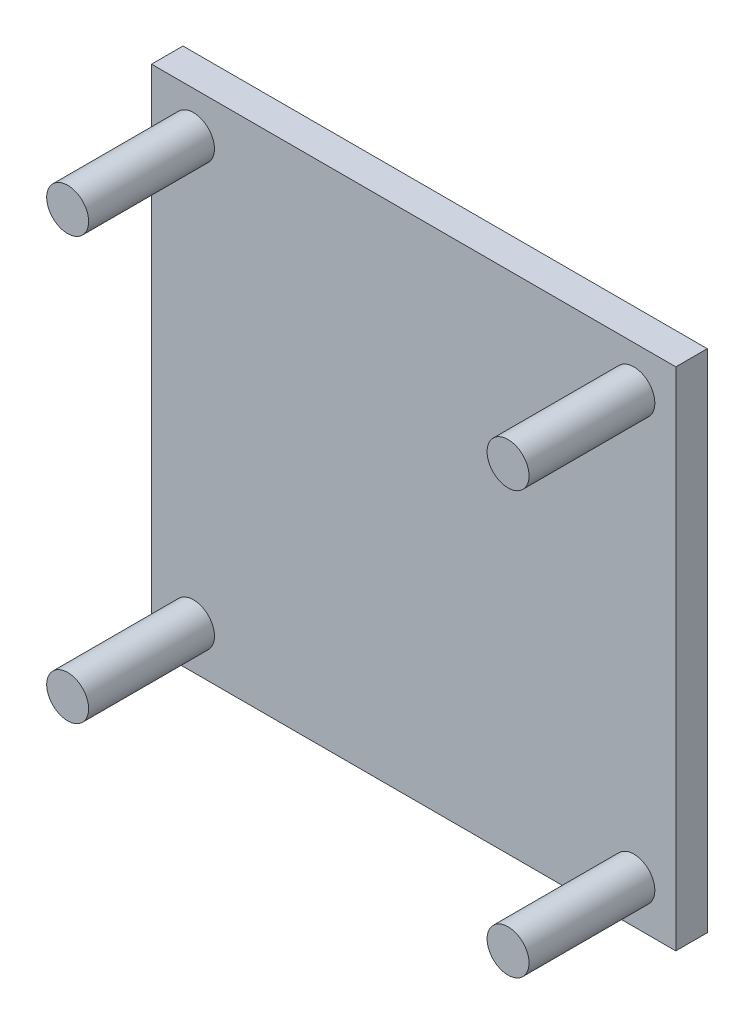
ISO-10303-21;
HEADER;
FILE_DESCRIPTION(('STEP AP214'),'2;1');
FILE_NAME('part.step','',(''),(''),'','','');
FILE_SCHEMA(('AUTOMOTIVE_DESIGN { 1 0 10303 214 1 1 1 1 }'));
ENDSEC;
DATA;
#1=APPLICATION_CONTEXT('core data for automotive mechanical design processes');
#2=APPLICATION_PROTOCOL_DEFINITION('international standard','automotive_design',2000,#1);
#3=PRODUCT_CONTEXT('',#1,'mechanical');
#4=PRODUCT('Part','Part','',(#3));
#5=PRODUCT_RELATED_PRODUCT_CATEGORY('part','',(#4));
#6=PRODUCT_DEFINITION_FORMATION('','',#4);
#7=PRODUCT_DEFINITION_CONTEXT('part definition',#1,'design');
#8=PRODUCT_DEFINITION('design','',#6,#7);
#9=PRODUCT_DEFINITION_SHAPE('','',#8);
#10=(LENGTH_UNIT() NAMED_UNIT(*) SI_UNIT(.MILLI.,.METRE.));
#11=(NAMED_UNIT(*) PLANE_ANGLE_UNIT() SI_UNIT($,.RADIAN.));
#12=(NAMED_UNIT(*) SI_UNIT($,.STERADIAN.) SOLID_ANGLE_UNIT());
#13=UNCERTAINTY_MEASURE_WITH_UNIT(LENGTH_MEASURE(1.E-05),#10,'distance_accuracy_value','');
#14=(GEOMETRIC_REPRESENTATION_CONTEXT(3) GLOBAL_UNCERTAINTY_ASSIGNED_CONTEXT((#13)) GLOBAL_UNIT_ASSIGNED_CONTEXT((#10,
#11,#12)) REPRESENTATION_CONTEXT('',''));
#15=CARTESIAN_POINT('',(0.,0.,0.));
#16=DIRECTION('',(0.,0.,1.));
#17=DIRECTION('',(1.,0.,0.));
#18=AXIS2_PLACEMENT_3D('',#15,#16,#17);
#19=CARTESIAN_POINT('',(-25.,24.1208742223421,3.));
#20=DIRECTION('',(1.,0.,0.));
#21=DIRECTION('',(0.,0.,-1.));
#22=AXIS2_PLACEMENT_3D('',#19,#20,#21);
#23=PLANE('',#22);
#24=DIRECTION('',(0.,-1.,0.));
#25=VECTOR('',#24,1.);
#26=CARTESIAN_POINT('',(-25.,24.1208742223421,0.));
#27=LINE('',#26,#25);
#28=CARTESIAN_POINT('',(-25.,24.1208742223421,0.));
#29=VERTEX_POINT('',#28);
#30=CARTESIAN_POINT('',(-25.,-24.1208742223421,0.));
#31=VERTEX_POINT('',#30);
#32=EDGE_CURVE('E100',#29,#31,#27,.T.);
#33=ORIENTED_EDGE('',*,*,#32,.T.);
#34=DIRECTION('',(0.,0.,-1.));
#35=VECTOR('',#34,1.);
#36=CARTESIAN_POINT('',(-25.,-24.1208742223421,3.));
#37=LINE('',#36,#35);
#38=CARTESIAN_POINT('',(-25.,-24.1208742223421,3.));
#39=VERTEX_POINT('',#38);
#40=EDGE_CURVE('E11',#39,#31,#37,.T.);
#41=ORIENTED_EDGE('',*,*,#40,.F.);
#42=DIRECTION('',(0.,-1.,0.));
#43=VECTOR('',#42,1.);
#44=CARTESIAN_POINT('',(-25.,24.1208742223421,3.));
#45=LINE('',#44,#43);
#46=CARTESIAN_POINT('',(-25.,24.1208742223421,3.));
#47=VERTEX_POINT('',#46);
#48=EDGE_CURVE('E88',#47,#39,#45,.T.);
#49=ORIENTED_EDGE('',*,*,#48,.F.);
#50=DIRECTION('',(0.,0.,-1.));
#51=VECTOR('',#50,1.);
#52=CARTESIAN_POINT('',(-25.,24.1208742223421,3.));
#53=LINE('',#52,#51);
#54=EDGE_CURVE('E96',#47,#29,#53,.T.);
#55=ORIENTED_EDGE('',*,*,#54,.T.);
#56=EDGE_LOOP('',(#33,#41,#49,#55));
#57=FACE_BOUND('',#56,.T.);
#58=ADVANCED_FACE('F37',(#57),#23,.F.);
#59=CARTESIAN_POINT('',(-25.,-24.1208742223421,3.));
#60=DIRECTION('',(0.,1.,0.));
#61=DIRECTION('',(0.,0.,1.));
#62=AXIS2_PLACEMENT_3D('',#59,#60,#61);
#63=PLANE('',#62);
#64=DIRECTION('',(1.,0.,0.));
#65=VECTOR('',#64,1.);
#66=CARTESIAN_POINT('',(-25.,-24.1208742223421,0.));
#67=LINE('',#66,#65);
#68=CARTESIAN_POINT('',(25.,-24.1208742223421,0.));
#69=VERTEX_POINT('',#68);
#70=EDGE_CURVE('E92',#31,#69,#67,.T.);
#71=ORIENTED_EDGE('',*,*,#70,.T.);
#72=DIRECTION('',(0.,0.,-1.));
#73=VECTOR('',#72,1.);
#74=CARTESIAN_POINT('',(25.,-24.1208742223421,3.));
#75=LINE('',#74,#73);
#76=CARTESIAN_POINT('',(25.,-24.1208742223421,3.));
#77=VERTEX_POINT('',#76);
#78=EDGE_CURVE('E45',#77,#69,#75,.T.);
#79=ORIENTED_EDGE('',*,*,#78,.F.);
#80=DIRECTION('',(1.,0.,0.));
#81=VECTOR('',#80,1.);
#82=CARTESIAN_POINT('',(-25.,-24.1208742223421,3.));
#83=LINE('',#82,#81);
#84=EDGE_CURVE('E83',#39,#77,#83,.T.);
#85=ORIENTED_EDGE('',*,*,#84,.F.);
#86=ORIENTED_EDGE('',*,*,#40,.T.);
#87=EDGE_LOOP('',(#71,#79,#85,#86));
#88=FACE_BOUND('',#87,.T.);
#89=ADVANCED_FACE('F91',(#88),#63,.F.);
#90=CARTESIAN_POINT('',(25.,-24.1208742223421,3.));
#91=DIRECTION('',(-1.,0.,0.));
#92=DIRECTION('',(0.,0.,1.));
#93=AXIS2_PLACEMENT_3D('',#90,#91,#92);
#94=PLANE('',#93);
#95=DIRECTION('',(0.,1.,0.));
#96=VECTOR('',#95,1.);
#97=CARTESIAN_POINT('',(25.,-24.1208742223421,0.));
#98=LINE('',#97,#96);
#99=CARTESIAN_POINT('',(25.,24.1208742223421,0.));
#100=VERTEX_POINT('',#99);
#101=EDGE_CURVE('E70',#69,#100,#98,.T.);
#102=ORIENTED_EDGE('',*,*,#101,.T.);
#103=DIRECTION('',(0.,0.,-1.));
#104=VECTOR('',#103,1.);
#105=CARTESIAN_POINT('',(25.,24.1208742223421,3.));
#106=LINE('',#105,#104);
#107=CARTESIAN_POINT('',(25.,24.1208742223421,3.));
#108=VERTEX_POINT('',#107);
#109=EDGE_CURVE('E93',#108,#100,#106,.T.);
#110=ORIENTED_EDGE('',*,*,#109,.F.);
#111=DIRECTION('',(0.,1.,0.));
#112=VECTOR('',#111,1.);
#113=CARTESIAN_POINT('',(25.,-24.1208742223421,3.));
#114=LINE('',#113,#112);
#115=EDGE_CURVE('E86',#77,#108,#114,.T.);
#116=ORIENTED_EDGE('',*,*,#115,.F.);
#117=ORIENTED_EDGE('',*,*,#78,.T.);
#118=EDGE_LOOP('',(#102,#110,#116,#117));
#119=FACE_BOUND('',#118,.T.);
#120=ADVANCED_FACE('F94',(#119),#94,.F.);
#121=CARTESIAN_POINT('',(25.,24.1208742223421,3.));
#122=DIRECTION('',(0.,-1.,0.));
#123=DIRECTION('',(0.,0.,-1.));
#124=AXIS2_PLACEMENT_3D('',#121,#122,#123);
#125=PLANE('',#124);
#126=DIRECTION('',(-1.,0.,0.));
#127=VECTOR('',#126,1.);
#128=CARTESIAN_POINT('',(25.,24.1208742223421,0.));
#129=LINE('',#128,#127);
#130=EDGE_CURVE('E76',#100,#29,#129,.T.);
#131=ORIENTED_EDGE('',*,*,#130,.T.);
#132=ORIENTED_EDGE('',*,*,#54,.F.);
#133=DIRECTION('',(-1.,0.,0.));
#134=VECTOR('',#133,1.);
#135=CARTESIAN_POINT('',(25.,24.1208742223421,3.));
#136=LINE('',#135,#134);
#137=EDGE_CURVE('E53',#108,#47,#136,.T.);
#138=ORIENTED_EDGE('',*,*,#137,.F.);
#139=ORIENTED_EDGE('',*,*,#109,.T.);
#140=EDGE_LOOP('',(#131,#132,#138,#139));
#141=FACE_BOUND('',#140,.T.);
#142=ADVANCED_FACE('F108',(#141),#125,.F.);
#143=CARTESIAN_POINT('',(0.,0.,3.));
#144=DIRECTION('',(0.,0.,1.));
#145=DIRECTION('',(1.,0.,0.));
#146=AXIS2_PLACEMENT_3D('',#143,#144,#145);
#147=PLANE('',#146);
#148=CARTESIAN_POINT('',(21.,20.1208742223421,3.));
#149=DIRECTION('',(0.,0.,1.));
#150=DIRECTION('',(1.,0.,0.));
#151=AXIS2_PLACEMENT_3D('',#148,#149,#150);
#152=CIRCLE('',#151,2.);
#153=CARTESIAN_POINT('',(23.,20.1208742223421,3.));
#154=VERTEX_POINT('',#153);
#155=EDGE_CURVE('E132',#154,#154,#152,.T.);
#156=ORIENTED_EDGE('',*,*,#155,.F.);
#157=EDGE_LOOP('',(#156));
#158=FACE_BOUND('',#157,.T.);
#159=CARTESIAN_POINT('',(21.,-20.1208742223421,3.));
#160=DIRECTION('',(0.,0.,1.));
#161=DIRECTION('',(1.,0.,0.));
#162=AXIS2_PLACEMENT_3D('',#159,#160,#161);
#163=CIRCLE('',#162,2.);
#164=CARTESIAN_POINT('',(23.,-20.1208742223421,3.));
#165=VERTEX_POINT('',#164);
#166=EDGE_CURVE('E126',#165,#165,#163,.T.);
#167=ORIENTED_EDGE('',*,*,#166,.F.);
#168=EDGE_LOOP('',(#167));
#169=FACE_BOUND('',#168,.T.);
#170=CARTESIAN_POINT('',(-21.,20.1208742223421,3.));
#171=DIRECTION('',(0.,0.,1.));
#172=DIRECTION('',(1.,0.,0.));
#173=AXIS2_PLACEMENT_3D('',#170,#171,#172);
#174=CIRCLE('',#173,2.);
#175=CARTESIAN_POINT('',(-19.,20.1208742223421,3.));
#176=VERTEX_POINT('',#175);
#177=EDGE_CURVE('E120',#176,#176,#174,.T.);
#178=ORIENTED_EDGE('',*,*,#177,.F.);
#179=EDGE_LOOP('',(#178));
#180=FACE_BOUND('',#179,.T.);
#181=CARTESIAN_POINT('',(-21.,-20.1208742223421,3.));
#182=DIRECTION('',(0.,0.,1.));
#183=DIRECTION('',(1.,0.,0.));
#184=AXIS2_PLACEMENT_3D('',#181,#182,#183);
#185=CIRCLE('',#184,2.);
#186=CARTESIAN_POINT('',(-19.,-20.1208742223421,3.));
#187=VERTEX_POINT('',#186);
#188=EDGE_CURVE('E114',#187,#187,#185,.T.);
#189=ORIENTED_EDGE('',*,*,#188,.F.);
#190=EDGE_LOOP('',(#189));
#191=FACE_BOUND('',#190,.T.);
#192=ORIENTED_EDGE('',*,*,#48,.T.);
#193=ORIENTED_EDGE('',*,*,#84,.T.);
#194=ORIENTED_EDGE('',*,*,#115,.T.);
#195=ORIENTED_EDGE('',*,*,#137,.T.);
#196=EDGE_LOOP('',(#192,#193,#194,#195));
#197=FACE_BOUND('',#196,.T.);
#198=ADVANCED_FACE('F84',(#158,#169,#180,#191,#197),#147,.T.);
#199=CARTESIAN_POINT('',(0.,0.,0.));
#200=DIRECTION('',(0.,0.,1.));
#201=DIRECTION('',(1.,0.,0.));
#202=AXIS2_PLACEMENT_3D('',#199,#200,#201);
#203=PLANE('',#202);
#204=ORIENTED_EDGE('',*,*,#32,.F.);
#205=ORIENTED_EDGE('',*,*,#130,.F.);
#206=ORIENTED_EDGE('',*,*,#101,.F.);
#207=ORIENTED_EDGE('',*,*,#70,.F.);
#208=EDGE_LOOP('',(#204,#205,#206,#207));
#209=FACE_BOUND('',#208,.T.);
#210=ADVANCED_FACE('F111',(#209),#203,.F.);
#211=CARTESIAN_POINT('',(-21.,-20.1208742223421,15.));
#212=DIRECTION('',(0.,0.,-1.));
#213=DIRECTION('',(-1.,0.,0.));
#214=AXIS2_PLACEMENT_3D('',#211,#212,#213);
#215=CYLINDRICAL_SURFACE('',#214,2.);
#216=CARTESIAN_POINT('',(-21.,-20.1208742223421,15.));
#217=DIRECTION('',(0.,0.,1.));
#218=DIRECTION('',(1.,0.,0.));
#219=AXIS2_PLACEMENT_3D('',#216,#217,#218);
#220=CIRCLE('',#219,2.);
#221=CARTESIAN_POINT('',(-19.,-20.1208742223421,15.));
#222=VERTEX_POINT('',#221);
#223=EDGE_CURVE('E103',#222,#222,#220,.T.);
#224=ORIENTED_EDGE('',*,*,#223,.F.);
#225=EDGE_LOOP('',(#224));
#226=FACE_BOUND('',#225,.T.);
#227=ORIENTED_EDGE('',*,*,#188,.T.);
#228=EDGE_LOOP('',(#227));
#229=FACE_BOUND('',#228,.T.);
#230=ADVANCED_FACE('F156',(#226,#229),#215,.T.);
#231=CARTESIAN_POINT('',(-21.,-20.1208742223421,15.));
#232=DIRECTION('',(0.,0.,1.));
#233=DIRECTION('',(1.,0.,0.));
#234=AXIS2_PLACEMENT_3D('',#231,#232,#233);
#235=PLANE('',#234);
#236=ORIENTED_EDGE('',*,*,#223,.T.);
#237=EDGE_LOOP('',(#236));
#238=FACE_BOUND('',#237,.T.);
#239=ADVANCED_FACE('F158',(#238),#235,.T.);
#240=CARTESIAN_POINT('',(-21.,20.1208742223421,15.));
#241=DIRECTION('',(0.,0.,-1.));
#242=DIRECTION('',(-1.,0.,0.));
#243=AXIS2_PLACEMENT_3D('',#240,#241,#242);
#244=CYLINDRICAL_SURFACE('',#243,2.);
#245=CARTESIAN_POINT('',(-21.,20.1208742223421,15.));
#246=DIRECTION('',(0.,0.,1.));
#247=DIRECTION('',(1.,0.,0.));
#248=AXIS2_PLACEMENT_3D('',#245,#246,#247);
#249=CIRCLE('',#248,2.);
#250=CARTESIAN_POINT('',(-19.,20.1208742223421,15.));
#251=VERTEX_POINT('',#250);
#252=EDGE_CURVE('E117',#251,#251,#249,.T.);
#253=ORIENTED_EDGE('',*,*,#252,.F.);
#254=EDGE_LOOP('',(#253));
#255=FACE_BOUND('',#254,.T.);
#256=ORIENTED_EDGE('',*,*,#177,.T.);
#257=EDGE_LOOP('',(#256));
#258=FACE_BOUND('',#257,.T.);
#259=ADVANCED_FACE('F165',(#255,#258),#244,.T.);
#260=CARTESIAN_POINT('',(-21.,20.1208742223421,15.));
#261=DIRECTION('',(0.,0.,1.));
#262=DIRECTION('',(1.,0.,0.));
#263=AXIS2_PLACEMENT_3D('',#260,#261,#262);
#264=PLANE('',#263);
#265=ORIENTED_EDGE('',*,*,#252,.T.);
#266=EDGE_LOOP('',(#265));
#267=FACE_BOUND('',#266,.T.);
#268=ADVANCED_FACE('F213',(#267),#264,.T.);
#269=CARTESIAN_POINT('',(21.,-20.1208742223421,15.));
#270=DIRECTION('',(0.,0.,-1.));
#271=DIRECTION('',(-1.,0.,0.));
#272=AXIS2_PLACEMENT_3D('',#269,#270,#271);
#273=CYLINDRICAL_SURFACE('',#272,2.);
#274=CARTESIAN_POINT('',(21.,-20.1208742223421,15.));
#275=DIRECTION('',(0.,0.,1.));
#276=DIRECTION('',(1.,0.,0.));
#277=AXIS2_PLACEMENT_3D('',#274,#275,#276);
#278=CIRCLE('',#277,2.);
#279=CARTESIAN_POINT('',(23.,-20.1208742223421,15.));
#280=VERTEX_POINT('',#279);
#281=EDGE_CURVE('E123',#280,#280,#278,.T.);
#282=ORIENTED_EDGE('',*,*,#281,.F.);
#283=EDGE_LOOP('',(#282));
#284=FACE_BOUND('',#283,.T.);
#285=ORIENTED_EDGE('',*,*,#166,.T.);
#286=EDGE_LOOP('',(#285));
#287=FACE_BOUND('',#286,.T.);
#288=ADVANCED_FACE('F222',(#284,#287),#273,.T.);
#289=CARTESIAN_POINT('',(21.,-20.1208742223421,15.));
#290=DIRECTION('',(0.,0.,1.));
#291=DIRECTION('',(1.,0.,0.));
#292=AXIS2_PLACEMENT_3D('',#289,#290,#291);
#293=PLANE('',#292);
#294=ORIENTED_EDGE('',*,*,#281,.T.);
#295=EDGE_LOOP('',(#294));
#296=FACE_BOUND('',#295,.T.);
#297=ADVANCED_FACE('F143',(#296),#293,.T.);
#298=CARTESIAN_POINT('',(21.,20.1208742223421,15.));
#299=DIRECTION('',(0.,0.,-1.));
#300=DIRECTION('',(-1.,0.,0.));
#301=AXIS2_PLACEMENT_3D('',#298,#299,#300);
#302=CYLINDRICAL_SURFACE('',#301,2.);
#303=CARTESIAN_POINT('',(21.,20.1208742223421,15.));
#304=DIRECTION('',(0.,0.,1.));
#305=DIRECTION('',(1.,0.,0.));
#306=AXIS2_PLACEMENT_3D('',#303,#304,#305);
#307=CIRCLE('',#306,2.);
#308=CARTESIAN_POINT('',(23.,20.1208742223421,15.));
#309=VERTEX_POINT('',#308);
#310=EDGE_CURVE('E129',#309,#309,#307,.T.);
#311=ORIENTED_EDGE('',*,*,#310,.F.);
#312=EDGE_LOOP('',(#311));
#313=FACE_BOUND('',#312,.T.);
#314=ORIENTED_EDGE('',*,*,#155,.T.);
#315=EDGE_LOOP('',(#314));
#316=FACE_BOUND('',#315,.T.);
#317=ADVANCED_FACE('F140',(#313,#316),#302,.T.);
#318=CARTESIAN_POINT('',(21.,20.1208742223421,15.));
#319=DIRECTION('',(0.,0.,1.));
#320=DIRECTION('',(1.,0.,0.));
#321=AXIS2_PLACEMENT_3D('',#318,#319,#320);
#322=PLANE('',#321);
#323=ORIENTED_EDGE('',*,*,#310,.T.);
#324=EDGE_LOOP('',(#323));
#325=FACE_BOUND('',#324,.T.);
#326=ADVANCED_FACE('F138',(#325),#322,.T.);
#327=CLOSED_SHELL('',(#58,#89,#120,#142,#198,#210,#230,#239,#259,#268,#288,#297,#317,#326));
#328=MANIFOLD_SOLID_BREP('B2',#327);
#329=ADVANCED_BREP_SHAPE_REPRESENTATION('',(#18,#328),#14);
#330=SHAPE_DEFINITION_REPRESENTATION(#9,#329);
ENDSEC;
END-ISO-10303-21;
